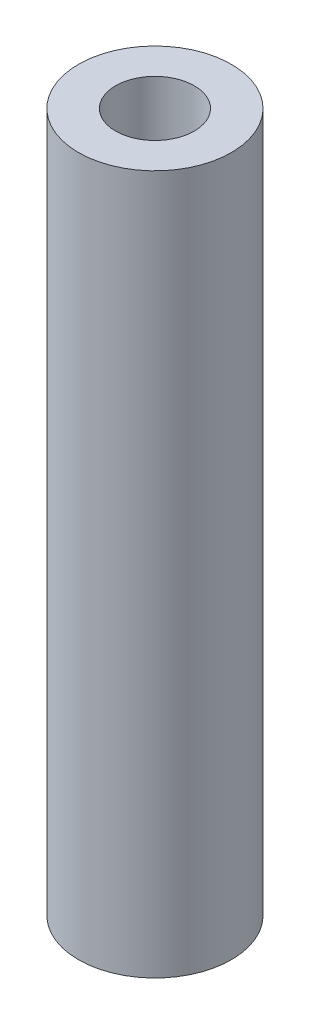
ISO-10303-21;
HEADER;
FILE_DESCRIPTION(('STEP AP214'),'2;1');
FILE_NAME('part.step','',(''),(''),'','','');
FILE_SCHEMA(('AUTOMOTIVE_DESIGN { 1 0 10303 214 1 1 1 1 }'));
ENDSEC;
DATA;
#1=APPLICATION_CONTEXT('core data for automotive mechanical design processes');
#2=APPLICATION_PROTOCOL_DEFINITION('international standard','automotive_design',2000,#1);
#3=PRODUCT_CONTEXT('',#1,'mechanical');
#4=PRODUCT('Part','Part','',(#3));
#5=PRODUCT_RELATED_PRODUCT_CATEGORY('part','',(#4));
#6=PRODUCT_DEFINITION_FORMATION('','',#4);
#7=PRODUCT_DEFINITION_CONTEXT('part definition',#1,'design');
#8=PRODUCT_DEFINITION('design','',#6,#7);
#9=PRODUCT_DEFINITION_SHAPE('','',#8);
#10=(LENGTH_UNIT() NAMED_UNIT(*) SI_UNIT(.MILLI.,.METRE.));
#11=(NAMED_UNIT(*) PLANE_ANGLE_UNIT() SI_UNIT($,.RADIAN.));
#12=(NAMED_UNIT(*) SI_UNIT($,.STERADIAN.) SOLID_ANGLE_UNIT());
#13=UNCERTAINTY_MEASURE_WITH_UNIT(LENGTH_MEASURE(1.E-05),#10,'distance_accuracy_value','');
#14=(GEOMETRIC_REPRESENTATION_CONTEXT(3) GLOBAL_UNCERTAINTY_ASSIGNED_CONTEXT((#13)) GLOBAL_UNIT_ASSIGNED_CONTEXT((#10,
#11,#12)) REPRESENTATION_CONTEXT('',''));
#15=CARTESIAN_POINT('',(0.,0.,0.));
#16=DIRECTION('',(0.,0.,1.));
#17=DIRECTION('',(1.,0.,0.));
#18=AXIS2_PLACEMENT_3D('',#15,#16,#17);
#19=CARTESIAN_POINT('',(0.,16.,0.));
#20=DIRECTION('',(0.,1.,0.));
#21=DIRECTION('',(0.,0.,1.));
#22=AXIS2_PLACEMENT_3D('',#19,#20,#21);
#23=PLANE('',#22);
#24=CARTESIAN_POINT('',(0.,16.,0.));
#25=DIRECTION('',(0.,1.,0.));
#26=DIRECTION('',(0.,0.,1.));
#27=AXIS2_PLACEMENT_3D('',#24,#25,#26);
#28=CIRCLE('',#27,1.75);
#29=CARTESIAN_POINT('',(0.,16.,1.75));
#30=VERTEX_POINT('',#29);
#31=EDGE_CURVE('E10',#30,#30,#28,.T.);
#32=ORIENTED_EDGE('',*,*,#31,.T.);
#33=EDGE_LOOP('',(#32));
#34=FACE_BOUND('',#33,.T.);
#35=CARTESIAN_POINT('',(0.,16.,0.));
#36=DIRECTION('',(0.,1.,0.));
#37=DIRECTION('',(0.,0.,1.));
#38=AXIS2_PLACEMENT_3D('',#35,#36,#37);
#39=CIRCLE('',#38,0.9);
#40=CARTESIAN_POINT('',(0.,16.,0.9));
#41=VERTEX_POINT('',#40);
#42=EDGE_CURVE('E48',#41,#41,#39,.T.);
#43=ORIENTED_EDGE('',*,*,#42,.F.);
#44=EDGE_LOOP('',(#43));
#45=FACE_BOUND('',#44,.T.);
#46=ADVANCED_FACE('F37',(#34,#45),#23,.T.);
#47=CARTESIAN_POINT('',(0.,0.,0.));
#48=DIRECTION('',(0.,1.,0.));
#49=DIRECTION('',(0.,0.,1.));
#50=AXIS2_PLACEMENT_3D('',#47,#48,#49);
#51=PLANE('',#50);
#52=CARTESIAN_POINT('',(0.,0.,0.));
#53=DIRECTION('',(0.,1.,0.));
#54=DIRECTION('',(0.,0.,1.));
#55=AXIS2_PLACEMENT_3D('',#52,#53,#54);
#56=CIRCLE('',#55,1.75);
#57=CARTESIAN_POINT('',(0.,0.,1.75));
#58=VERTEX_POINT('',#57);
#59=EDGE_CURVE('E41',#58,#58,#56,.T.);
#60=ORIENTED_EDGE('',*,*,#59,.F.);
#61=EDGE_LOOP('',(#60));
#62=FACE_BOUND('',#61,.T.);
#63=CARTESIAN_POINT('',(0.,0.,0.));
#64=DIRECTION('',(0.,1.,0.));
#65=DIRECTION('',(0.,0.,1.));
#66=AXIS2_PLACEMENT_3D('',#63,#64,#65);
#67=CIRCLE('',#66,0.9);
#68=CARTESIAN_POINT('',(0.,0.,0.9));
#69=VERTEX_POINT('',#68);
#70=EDGE_CURVE('E50',#69,#69,#67,.T.);
#71=ORIENTED_EDGE('',*,*,#70,.T.);
#72=EDGE_LOOP('',(#71));
#73=FACE_BOUND('',#72,.T.);
#74=ADVANCED_FACE('F60',(#62,#73),#51,.F.);
#75=CARTESIAN_POINT('',(0.,16.,0.));
#76=DIRECTION('',(0.,-1.,0.));
#77=DIRECTION('',(0.,0.,-1.));
#78=AXIS2_PLACEMENT_3D('',#75,#76,#77);
#79=CYLINDRICAL_SURFACE('',#78,1.75);
#80=ORIENTED_EDGE('',*,*,#31,.F.);
#81=EDGE_LOOP('',(#80));
#82=FACE_BOUND('',#81,.T.);
#83=ORIENTED_EDGE('',*,*,#59,.T.);
#84=EDGE_LOOP('',(#83));
#85=FACE_BOUND('',#84,.T.);
#86=ADVANCED_FACE('F39',(#82,#85),#79,.T.);
#87=CARTESIAN_POINT('',(0.,16.,0.));
#88=DIRECTION('',(0.,-1.,0.));
#89=DIRECTION('',(0.,0.,-1.));
#90=AXIS2_PLACEMENT_3D('',#87,#88,#89);
#91=CYLINDRICAL_SURFACE('',#90,0.9);
#92=ORIENTED_EDGE('',*,*,#42,.T.);
#93=EDGE_LOOP('',(#92));
#94=FACE_BOUND('',#93,.T.);
#95=ORIENTED_EDGE('',*,*,#70,.F.);
#96=EDGE_LOOP('',(#95));
#97=FACE_BOUND('',#96,.T.);
#98=ADVANCED_FACE('F56',(#94,#97),#91,.F.);
#99=CLOSED_SHELL('',(#46,#74,#86,#98));
#100=MANIFOLD_SOLID_BREP('B2',#99);
#101=ADVANCED_BREP_SHAPE_REPRESENTATION('',(#18,#100),#14);
#102=SHAPE_DEFINITION_REPRESENTATION(#9,#101);
ENDSEC;
END-ISO-10303-21;
